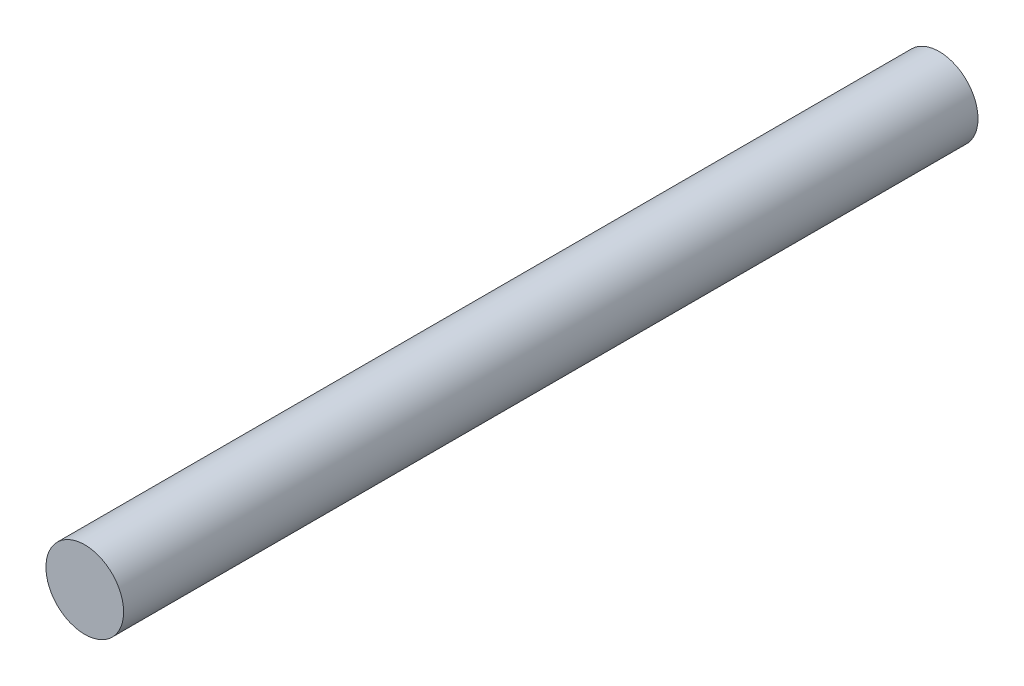
ISO-10303-21;
HEADER;
FILE_DESCRIPTION(('STEP AP214'),'2;1');
FILE_NAME('part.step','',(''),(''),'','','');
FILE_SCHEMA(('AUTOMOTIVE_DESIGN { 1 0 10303 214 1 1 1 1 }'));
ENDSEC;
DATA;
#1=APPLICATION_CONTEXT('core data for automotive mechanical design processes');
#2=APPLICATION_PROTOCOL_DEFINITION('international standard','automotive_design',2000,#1);
#3=PRODUCT_CONTEXT('',#1,'mechanical');
#4=PRODUCT('Part','Part','',(#3));
#5=PRODUCT_RELATED_PRODUCT_CATEGORY('part','',(#4));
#6=PRODUCT_DEFINITION_FORMATION('','',#4);
#7=PRODUCT_DEFINITION_CONTEXT('part definition',#1,'design');
#8=PRODUCT_DEFINITION('design','',#6,#7);
#9=PRODUCT_DEFINITION_SHAPE('','',#8);
#10=(LENGTH_UNIT() NAMED_UNIT(*) SI_UNIT(.MILLI.,.METRE.));
#11=(NAMED_UNIT(*) PLANE_ANGLE_UNIT() SI_UNIT($,.RADIAN.));
#12=(NAMED_UNIT(*) SI_UNIT($,.STERADIAN.) SOLID_ANGLE_UNIT());
#13=UNCERTAINTY_MEASURE_WITH_UNIT(LENGTH_MEASURE(1.E-05),#10,'distance_accuracy_value','');
#14=(GEOMETRIC_REPRESENTATION_CONTEXT(3) GLOBAL_UNCERTAINTY_ASSIGNED_CONTEXT((#13)) GLOBAL_UNIT_ASSIGNED_CONTEXT((#10,
#11,#12)) REPRESENTATION_CONTEXT('',''));
#15=CARTESIAN_POINT('',(0.,0.,0.));
#16=DIRECTION('',(0.,0.,1.));
#17=DIRECTION('',(1.,0.,0.));
#18=AXIS2_PLACEMENT_3D('',#15,#16,#17);
#19=CARTESIAN_POINT('',(0.,0.,110.));
#20=DIRECTION('',(0.,0.,-1.));
#21=DIRECTION('',(-1.,0.,0.));
#22=AXIS2_PLACEMENT_3D('',#19,#20,#21);
#23=CYLINDRICAL_SURFACE('',#22,5.);
#24=CARTESIAN_POINT('',(0.,0.,110.));
#25=DIRECTION('',(0.,0.,1.));
#26=DIRECTION('',(1.,0.,0.));
#27=AXIS2_PLACEMENT_3D('',#24,#25,#26);
#28=CIRCLE('',#27,5.);
#29=CARTESIAN_POINT('',(5.,0.,110.));
#30=VERTEX_POINT('',#29);
#31=EDGE_CURVE('E10',#30,#30,#28,.T.);
#32=ORIENTED_EDGE('',*,*,#31,.F.);
#33=EDGE_LOOP('',(#32));
#34=FACE_BOUND('',#33,.T.);
#35=CARTESIAN_POINT('',(0.,0.,0.));
#36=DIRECTION('',(0.,0.,1.));
#37=DIRECTION('',(1.,0.,0.));
#38=AXIS2_PLACEMENT_3D('',#35,#36,#37);
#39=CIRCLE('',#38,5.);
#40=CARTESIAN_POINT('',(5.,0.,0.));
#41=VERTEX_POINT('',#40);
#42=EDGE_CURVE('E36',#41,#41,#39,.T.);
#43=ORIENTED_EDGE('',*,*,#42,.T.);
#44=EDGE_LOOP('',(#43));
#45=FACE_BOUND('',#44,.T.);
#46=ADVANCED_FACE('F33',(#34,#45),#23,.T.);
#47=CARTESIAN_POINT('',(0.,0.,110.));
#48=DIRECTION('',(0.,0.,1.));
#49=DIRECTION('',(1.,0.,0.));
#50=AXIS2_PLACEMENT_3D('',#47,#48,#49);
#51=PLANE('',#50);
#52=ORIENTED_EDGE('',*,*,#31,.T.);
#53=EDGE_LOOP('',(#52));
#54=FACE_BOUND('',#53,.T.);
#55=ADVANCED_FACE('F48',(#54),#51,.T.);
#56=CARTESIAN_POINT('',(0.,0.,0.));
#57=DIRECTION('',(0.,0.,1.));
#58=DIRECTION('',(1.,0.,0.));
#59=AXIS2_PLACEMENT_3D('',#56,#57,#58);
#60=PLANE('',#59);
#61=ORIENTED_EDGE('',*,*,#42,.F.);
#62=EDGE_LOOP('',(#61));
#63=FACE_BOUND('',#62,.T.);
#64=ADVANCED_FACE('F46',(#63),#60,.F.);
#65=CLOSED_SHELL('',(#46,#55,#64));
#66=MANIFOLD_SOLID_BREP('B2',#65);
#67=ADVANCED_BREP_SHAPE_REPRESENTATION('',(#18,#66),#14);
#68=SHAPE_DEFINITION_REPRESENTATION(#9,#67);
ENDSEC;
END-ISO-10303-21;
